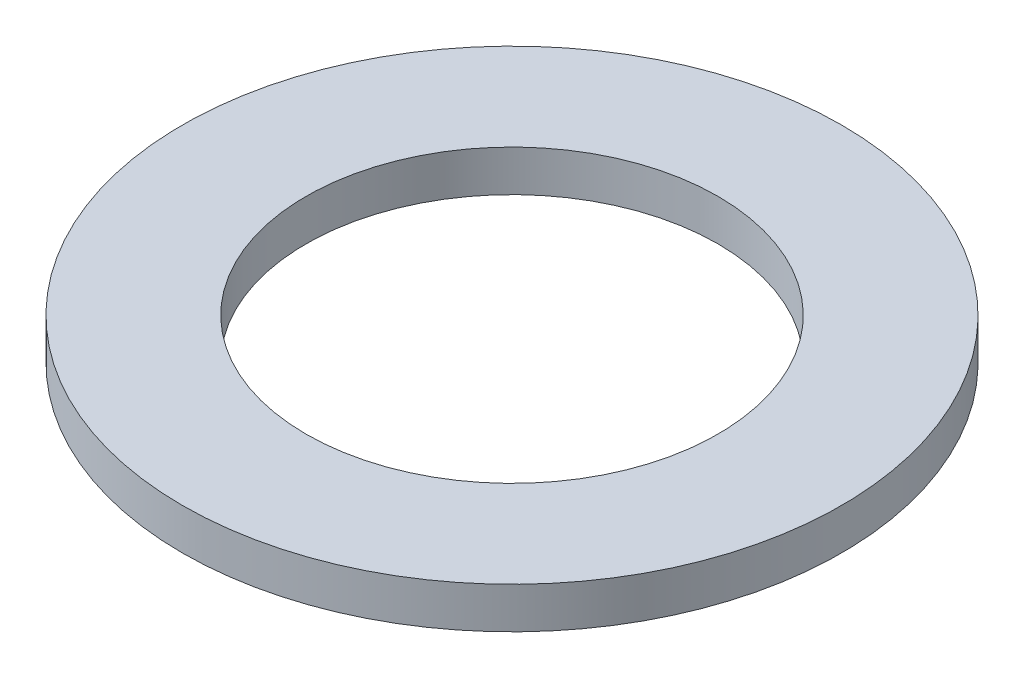
ISO-10303-21;
HEADER;
FILE_DESCRIPTION(('STEP AP214'),'2;1');
FILE_NAME('part.step','',(''),(''),'','','');
FILE_SCHEMA(('AUTOMOTIVE_DESIGN { 1 0 10303 214 1 1 1 1 }'));
ENDSEC;
DATA;
#1=APPLICATION_CONTEXT('core data for automotive mechanical design processes');
#2=APPLICATION_PROTOCOL_DEFINITION('international standard','automotive_design',2000,#1);
#3=PRODUCT_CONTEXT('',#1,'mechanical');
#4=PRODUCT('Part','Part','',(#3));
#5=PRODUCT_RELATED_PRODUCT_CATEGORY('part','',(#4));
#6=PRODUCT_DEFINITION_FORMATION('','',#4);
#7=PRODUCT_DEFINITION_CONTEXT('part definition',#1,'design');
#8=PRODUCT_DEFINITION('design','',#6,#7);
#9=PRODUCT_DEFINITION_SHAPE('','',#8);
#10=(LENGTH_UNIT() NAMED_UNIT(*) SI_UNIT(.MILLI.,.METRE.));
#11=(NAMED_UNIT(*) PLANE_ANGLE_UNIT() SI_UNIT($,.RADIAN.));
#12=(NAMED_UNIT(*) SI_UNIT($,.STERADIAN.) SOLID_ANGLE_UNIT());
#13=UNCERTAINTY_MEASURE_WITH_UNIT(LENGTH_MEASURE(1.E-05),#10,'distance_accuracy_value','');
#14=(GEOMETRIC_REPRESENTATION_CONTEXT(3) GLOBAL_UNCERTAINTY_ASSIGNED_CONTEXT((#13)) GLOBAL_UNIT_ASSIGNED_CONTEXT((#10,
#11,#12)) REPRESENTATION_CONTEXT('',''));
#15=CARTESIAN_POINT('',(0.,0.,0.));
#16=DIRECTION('',(0.,0.,1.));
#17=DIRECTION('',(1.,0.,0.));
#18=AXIS2_PLACEMENT_3D('',#15,#16,#17);
#19=CARTESIAN_POINT('',(0.,1.,0.));
#20=DIRECTION('',(0.,-1.,0.));
#21=DIRECTION('',(0.,0.,-1.));
#22=AXIS2_PLACEMENT_3D('',#19,#20,#21);
#23=CYLINDRICAL_SURFACE('',#22,8.);
#24=CARTESIAN_POINT('',(0.,1.,0.));
#25=DIRECTION('',(0.,1.,0.));
#26=DIRECTION('',(0.,0.,1.));
#27=AXIS2_PLACEMENT_3D('',#24,#25,#26);
#28=CIRCLE('',#27,8.);
#29=CARTESIAN_POINT('',(0.,1.,8.));
#30=VERTEX_POINT('',#29);
#31=EDGE_CURVE('E10',#30,#30,#28,.T.);
#32=ORIENTED_EDGE('',*,*,#31,.F.);
#33=EDGE_LOOP('',(#32));
#34=FACE_BOUND('',#33,.T.);
#35=CARTESIAN_POINT('',(0.,0.,0.));
#36=DIRECTION('',(0.,1.,0.));
#37=DIRECTION('',(0.,0.,1.));
#38=AXIS2_PLACEMENT_3D('',#35,#36,#37);
#39=CIRCLE('',#38,8.);
#40=CARTESIAN_POINT('',(0.,0.,8.));
#41=VERTEX_POINT('',#40);
#42=EDGE_CURVE('E33',#41,#41,#39,.T.);
#43=ORIENTED_EDGE('',*,*,#42,.T.);
#44=EDGE_LOOP('',(#43));
#45=FACE_BOUND('',#44,.T.);
#46=ADVANCED_FACE('F30',(#34,#45),#23,.T.);
#47=CARTESIAN_POINT('',(0.,1.,0.));
#48=DIRECTION('',(0.,1.,0.));
#49=DIRECTION('',(0.,0.,1.));
#50=AXIS2_PLACEMENT_3D('',#47,#48,#49);
#51=PLANE('',#50);
#52=CARTESIAN_POINT('',(0.,1.,0.));
#53=DIRECTION('',(0.,1.,0.));
#54=DIRECTION('',(0.,0.,1.));
#55=AXIS2_PLACEMENT_3D('',#52,#53,#54);
#56=CIRCLE('',#55,5.);
#57=CARTESIAN_POINT('',(0.,1.,5.));
#58=VERTEX_POINT('',#57);
#59=EDGE_CURVE('E42',#58,#58,#56,.T.);
#60=ORIENTED_EDGE('',*,*,#59,.F.);
#61=EDGE_LOOP('',(#60));
#62=FACE_BOUND('',#61,.T.);
#63=ORIENTED_EDGE('',*,*,#31,.T.);
#64=EDGE_LOOP('',(#63));
#65=FACE_BOUND('',#64,.T.);
#66=ADVANCED_FACE('F57',(#62,#65),#51,.T.);
#67=CARTESIAN_POINT('',(0.,0.,0.));
#68=DIRECTION('',(0.,1.,0.));
#69=DIRECTION('',(0.,0.,1.));
#70=AXIS2_PLACEMENT_3D('',#67,#68,#69);
#71=PLANE('',#70);
#72=CARTESIAN_POINT('',(0.,0.,0.));
#73=DIRECTION('',(0.,1.,0.));
#74=DIRECTION('',(0.,0.,1.));
#75=AXIS2_PLACEMENT_3D('',#72,#73,#74);
#76=CIRCLE('',#75,5.);
#77=CARTESIAN_POINT('',(0.,0.,5.));
#78=VERTEX_POINT('',#77);
#79=EDGE_CURVE('E40',#78,#78,#76,.T.);
#80=ORIENTED_EDGE('',*,*,#79,.T.);
#81=EDGE_LOOP('',(#80));
#82=FACE_BOUND('',#81,.T.);
#83=ORIENTED_EDGE('',*,*,#42,.F.);
#84=EDGE_LOOP('',(#83));
#85=FACE_BOUND('',#84,.T.);
#86=ADVANCED_FACE('F48',(#82,#85),#71,.F.);
#87=CARTESIAN_POINT('',(0.,0.,0.));
#88=DIRECTION('',(0.,1.,0.));
#89=DIRECTION('',(0.,0.,1.));
#90=AXIS2_PLACEMENT_3D('',#87,#88,#89);
#91=CYLINDRICAL_SURFACE('',#90,5.);
#92=ORIENTED_EDGE('',*,*,#79,.F.);
#93=EDGE_LOOP('',(#92));
#94=FACE_BOUND('',#93,.T.);
#95=ORIENTED_EDGE('',*,*,#59,.T.);
#96=EDGE_LOOP('',(#95));
#97=FACE_BOUND('',#96,.T.);
#98=ADVANCED_FACE('F51',(#94,#97),#91,.F.);
#99=CLOSED_SHELL('',(#46,#66,#86,#98));
#100=MANIFOLD_SOLID_BREP('B2',#99);
#101=ADVANCED_BREP_SHAPE_REPRESENTATION('',(#18,#100),#14);
#102=SHAPE_DEFINITION_REPRESENTATION(#9,#101);
ENDSEC;
END-ISO-10303-21;
